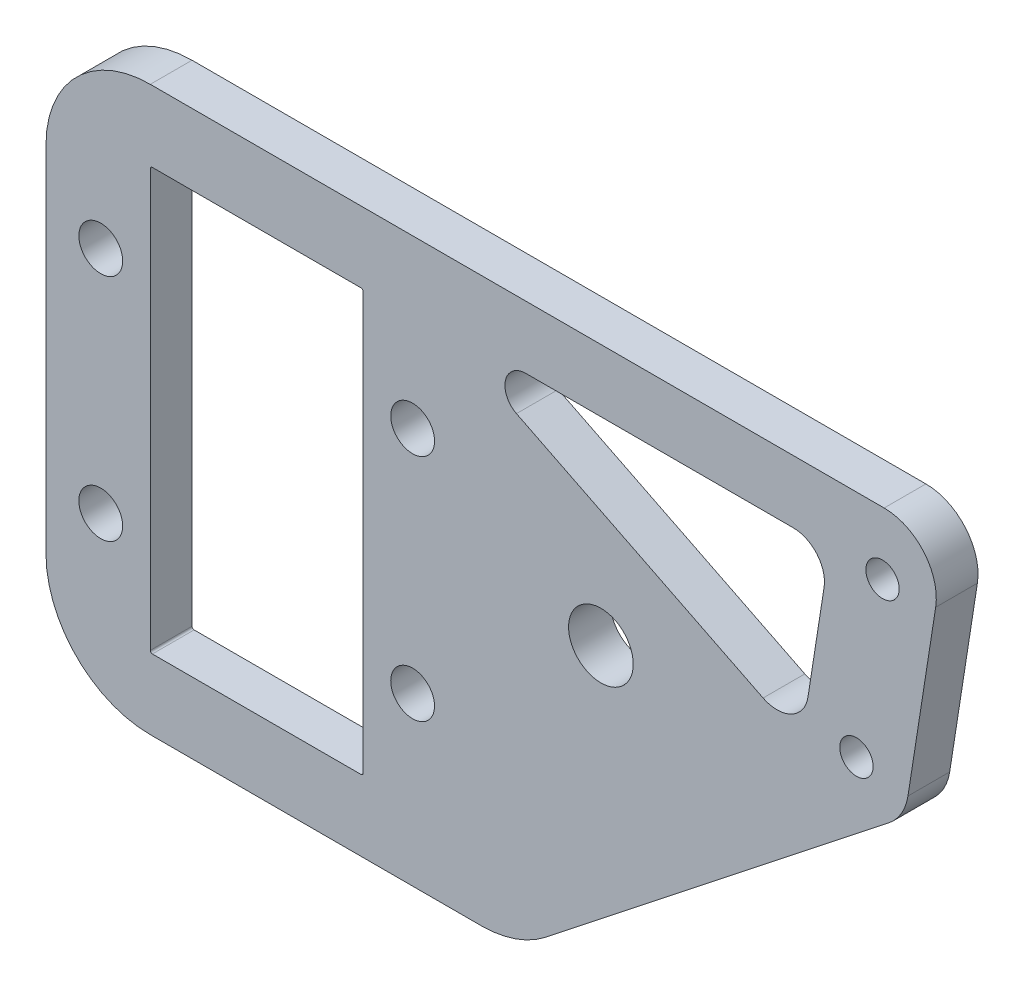
ISO-10303-21;
HEADER;
FILE_DESCRIPTION(('STEP AP214'),'2;1');
FILE_NAME('part.step','',(''),(''),'','','');
FILE_SCHEMA(('AUTOMOTIVE_DESIGN { 1 0 10303 214 1 1 1 1 }'));
ENDSEC;
DATA;
#1=APPLICATION_CONTEXT('core data for automotive mechanical design processes');
#2=APPLICATION_PROTOCOL_DEFINITION('international standard','automotive_design',2000,#1);
#3=PRODUCT_CONTEXT('',#1,'mechanical');
#4=PRODUCT('Part','Part','',(#3));
#5=PRODUCT_RELATED_PRODUCT_CATEGORY('part','',(#4));
#6=PRODUCT_DEFINITION_FORMATION('','',#4);
#7=PRODUCT_DEFINITION_CONTEXT('part definition',#1,'design');
#8=PRODUCT_DEFINITION('design','',#6,#7);
#9=PRODUCT_DEFINITION_SHAPE('','',#8);
#10=(LENGTH_UNIT() NAMED_UNIT(*) SI_UNIT(.MILLI.,.METRE.));
#11=(NAMED_UNIT(*) PLANE_ANGLE_UNIT() SI_UNIT($,.RADIAN.));
#12=(NAMED_UNIT(*) SI_UNIT($,.STERADIAN.) SOLID_ANGLE_UNIT());
#13=UNCERTAINTY_MEASURE_WITH_UNIT(LENGTH_MEASURE(1.E-05),#10,'distance_accuracy_value','');
#14=(GEOMETRIC_REPRESENTATION_CONTEXT(3) GLOBAL_UNCERTAINTY_ASSIGNED_CONTEXT((#13)) GLOBAL_UNIT_ASSIGNED_CONTEXT((#10,
#11,#12)) REPRESENTATION_CONTEXT('',''));
#15=CARTESIAN_POINT('',(0.,0.,0.));
#16=DIRECTION('',(0.,0.,1.));
#17=DIRECTION('',(1.,0.,0.));
#18=AXIS2_PLACEMENT_3D('',#15,#16,#17);
#19=CARTESIAN_POINT('',(-10.2,-17.,4.));
#20=DIRECTION('',(0.,0.,-1.));
#21=DIRECTION('',(-1.,0.,0.));
#22=AXIS2_PLACEMENT_3D('',#19,#20,#21);
#23=PLANE('',#22);
#24=DIRECTION('',(-1.,0.,0.));
#25=VECTOR('',#24,1.);
#26=CARTESIAN_POINT('',(25.7980162916883,21.,4.));
#27=LINE('',#26,#25);
#28=CARTESIAN_POINT('',(51.4341826296492,21.,4.));
#29=VERTEX_POINT('',#28);
#30=CARTESIAN_POINT('',(25.7980162916883,21.,4.));
#31=VERTEX_POINT('',#30);
#32=EDGE_CURVE('E210',#29,#31,#27,.T.);
#33=ORIENTED_EDGE('',*,*,#32,.F.);
#34=CARTESIAN_POINT('',(51.4341826296492,18.,4.));
#35=DIRECTION('',(0.,0.,1.));
#36=DIRECTION('',(1.,0.,0.));
#37=AXIS2_PLACEMENT_3D('',#34,#35,#36);
#38=CIRCLE('',#37,3.);
#39=CARTESIAN_POINT('',(54.3982187309025,17.5368693591792,4.));
#40=VERTEX_POINT('',#39);
#41=EDGE_CURVE('E53',#40,#29,#38,.T.);
#42=ORIENTED_EDGE('',*,*,#41,.F.);
#43=DIRECTION('',(0.15437688027361,0.988012033751101,0.));
#44=VECTOR('',#43,1.);
#45=CARTESIAN_POINT('',(54.3982187309025,17.5368693591792,4.));
#46=LINE('',#45,#44);
#47=CARTESIAN_POINT('',(52.8522329335242,7.64256025595795,4.));
#48=VERTEX_POINT('',#47);
#49=EDGE_CURVE('E225',#48,#40,#46,.T.);
#50=ORIENTED_EDGE('',*,*,#49,.F.);
#51=CARTESIAN_POINT('',(49.8881968322709,8.10569089677878,4.));
#52=DIRECTION('',(0.,0.,1.));
#53=DIRECTION('',(1.,0.,0.));
#54=AXIS2_PLACEMENT_3D('',#51,#52,#53);
#55=CIRCLE('',#54,2.99999999999999);
#56=CARTESIAN_POINT('',(48.5495316817207,5.42092356706426,4.));
#57=VERTEX_POINT('',#56);
#58=EDGE_CURVE('E219',#57,#48,#55,.T.);
#59=ORIENTED_EDGE('',*,*,#58,.F.);
#60=DIRECTION('',(0.894922443238175,-0.44622171685006,0.));
#61=VECTOR('',#60,1.);
#62=CARTESIAN_POINT('',(48.5495316817207,5.42092356706425,4.));
#63=LINE('',#62,#61);
#64=CARTESIAN_POINT('',(24.9055728579882,17.2101551135237,4.));
#65=VERTEX_POINT('',#64);
#66=EDGE_CURVE('E217',#65,#57,#63,.T.);
#67=ORIENTED_EDGE('',*,*,#66,.F.);
#68=CARTESIAN_POINT('',(25.7980162916883,19.,4.));
#69=DIRECTION('',(0.,0.,1.));
#70=DIRECTION('',(-1.,0.,0.));
#71=AXIS2_PLACEMENT_3D('',#68,#69,#70);
#72=CIRCLE('',#71,2.);
#73=EDGE_CURVE('E201',#31,#65,#72,.T.);
#74=ORIENTED_EDGE('',*,*,#73,.F.);
#75=EDGE_LOOP('',(#33,#42,#50,#59,#67,#74));
#76=FACE_BOUND('',#75,.T.);
#77=CARTESIAN_POINT('',(-14.95,11.,4.));
#78=DIRECTION('',(0.,0.,1.));
#79=DIRECTION('',(-1.,0.,0.));
#80=AXIS2_PLACEMENT_3D('',#77,#78,#79);
#81=CIRCLE('',#80,2.1);
#82=CARTESIAN_POINT('',(-17.05,11.,4.));
#83=VERTEX_POINT('',#82);
#84=EDGE_CURVE('E230',#83,#83,#81,.T.);
#85=ORIENTED_EDGE('',*,*,#84,.F.);
#86=EDGE_LOOP('',(#85));
#87=FACE_BOUND('',#86,.T.);
#88=CARTESIAN_POINT('',(-14.95,-11.,4.));
#89=DIRECTION('',(0.,0.,1.));
#90=DIRECTION('',(1.,0.,0.));
#91=AXIS2_PLACEMENT_3D('',#88,#89,#90);
#92=CIRCLE('',#91,2.1);
#93=CARTESIAN_POINT('',(-12.85,-11.,4.));
#94=VERTEX_POINT('',#93);
#95=EDGE_CURVE('E247',#94,#94,#92,.T.);
#96=ORIENTED_EDGE('',*,*,#95,.F.);
#97=EDGE_LOOP('',(#96));
#98=FACE_BOUND('',#97,.T.);
#99=CARTESIAN_POINT('',(14.95,-11.,4.));
#100=DIRECTION('',(0.,0.,1.));
#101=DIRECTION('',(-1.,0.,0.));
#102=AXIS2_PLACEMENT_3D('',#99,#100,#101);
#103=CIRCLE('',#102,2.1);
#104=CARTESIAN_POINT('',(12.85,-11.,4.));
#105=VERTEX_POINT('',#104);
#106=EDGE_CURVE('E241',#105,#105,#103,.T.);
#107=ORIENTED_EDGE('',*,*,#106,.F.);
#108=EDGE_LOOP('',(#107));
#109=FACE_BOUND('',#108,.T.);
#110=CARTESIAN_POINT('',(14.95,11.,4.));
#111=DIRECTION('',(0.,0.,1.));
#112=DIRECTION('',(1.,0.,0.));
#113=AXIS2_PLACEMENT_3D('',#110,#111,#112);
#114=CIRCLE('',#113,2.1);
#115=CARTESIAN_POINT('',(17.05,11.,4.));
#116=VERTEX_POINT('',#115);
#117=EDGE_CURVE('E240',#116,#116,#114,.T.);
#118=ORIENTED_EDGE('',*,*,#117,.F.);
#119=EDGE_LOOP('',(#118));
#120=FACE_BOUND('',#119,.T.);
#121=CARTESIAN_POINT('',(-10.2,-17.,4.));
#122=DIRECTION('',(0.,0.,1.));
#123=DIRECTION('',(-1.,0.,0.));
#124=AXIS2_PLACEMENT_3D('',#121,#122,#123);
#125=CIRCLE('',#124,10.);
#126=CARTESIAN_POINT('',(-20.2,-17.,4.));
#127=VERTEX_POINT('',#126);
#128=CARTESIAN_POINT('',(-10.2,-27.,4.));
#129=VERTEX_POINT('',#128);
#130=EDGE_CURVE('E303',#127,#129,#125,.T.);
#131=ORIENTED_EDGE('',*,*,#130,.T.);
#132=DIRECTION('',(1.,0.,0.));
#133=VECTOR('',#132,1.);
#134=CARTESIAN_POINT('',(21.5311175215682,-27.,4.));
#135=LINE('',#134,#133);
#136=CARTESIAN_POINT('',(21.5311175215682,-27.,4.));
#137=VERTEX_POINT('',#136);
#138=EDGE_CURVE('E306',#129,#137,#135,.T.);
#139=ORIENTED_EDGE('',*,*,#138,.T.);
#140=CARTESIAN_POINT('',(21.5311175215682,-17.,4.));
#141=DIRECTION('',(0.,0.,1.));
#142=DIRECTION('',(1.,0.,0.));
#143=AXIS2_PLACEMENT_3D('',#140,#141,#142);
#144=CIRCLE('',#143,10.);
#145=CARTESIAN_POINT('',(27.7237178602118,-24.8518597189349,4.));
#146=VERTEX_POINT('',#145);
#147=EDGE_CURVE('E309',#137,#146,#144,.T.);
#148=ORIENTED_EDGE('',*,*,#147,.T.);
#149=DIRECTION('',(0.785185971893485,0.619260033864355,0.));
#150=VECTOR('',#149,1.);
#151=CARTESIAN_POINT('',(27.7237178602118,-24.8518597189349,4.));
#152=LINE('',#151,#150);
#153=CARTESIAN_POINT('',(60.5963001693218,1.07407014053258,4.));
#154=VERTEX_POINT('',#153);
#155=EDGE_CURVE('E311',#146,#154,#152,.T.);
#156=ORIENTED_EDGE('',*,*,#155,.T.);
#157=CARTESIAN_POINT('',(57.5,5.,4.));
#158=DIRECTION('',(0.,0.,1.));
#159=DIRECTION('',(1.,0.,0.));
#160=AXIS2_PLACEMENT_3D('',#157,#158,#159);
#161=CIRCLE('',#160,4.99999999999999);
#162=CARTESIAN_POINT('',(62.4400601687555,4.22811559863195,4.));
#163=VERTEX_POINT('',#162);
#164=EDGE_CURVE('E313',#154,#163,#161,.T.);
#165=ORIENTED_EDGE('',*,*,#164,.T.);
#166=DIRECTION('',(0.15437688027361,0.988012033751101,0.));
#167=VECTOR('',#166,1.);
#168=CARTESIAN_POINT('',(62.4400601687555,4.22811559863195,4.));
#169=LINE('',#168,#167);
#170=CARTESIAN_POINT('',(65.0963101687555,21.228115598632,4.));
#171=VERTEX_POINT('',#170);
#172=EDGE_CURVE('E315',#163,#171,#169,.T.);
#173=ORIENTED_EDGE('',*,*,#172,.T.);
#174=CARTESIAN_POINT('',(60.15625,22.,4.));
#175=DIRECTION('',(0.,0.,1.));
#176=DIRECTION('',(1.,0.,0.));
#177=AXIS2_PLACEMENT_3D('',#174,#175,#176);
#178=CIRCLE('',#177,5.);
#179=CARTESIAN_POINT('',(60.15625,27.,4.));
#180=VERTEX_POINT('',#179);
#181=EDGE_CURVE('E317',#171,#180,#178,.T.);
#182=ORIENTED_EDGE('',*,*,#181,.T.);
#183=DIRECTION('',(-1.,0.,0.));
#184=VECTOR('',#183,1.);
#185=CARTESIAN_POINT('',(-10.2,27.,4.));
#186=LINE('',#185,#184);
#187=CARTESIAN_POINT('',(-10.2,27.,4.));
#188=VERTEX_POINT('',#187);
#189=EDGE_CURVE('E319',#180,#188,#186,.T.);
#190=ORIENTED_EDGE('',*,*,#189,.T.);
#191=CARTESIAN_POINT('',(-10.2,17.,4.));
#192=DIRECTION('',(0.,0.,1.));
#193=DIRECTION('',(1.,0.,0.));
#194=AXIS2_PLACEMENT_3D('',#191,#192,#193);
#195=CIRCLE('',#194,10.);
#196=CARTESIAN_POINT('',(-20.2,17.,4.));
#197=VERTEX_POINT('',#196);
#198=EDGE_CURVE('E321',#188,#197,#195,.T.);
#199=ORIENTED_EDGE('',*,*,#198,.T.);
#200=DIRECTION('',(0.,-1.,0.));
#201=VECTOR('',#200,1.);
#202=CARTESIAN_POINT('',(-20.2,-17.,4.));
#203=LINE('',#202,#201);
#204=EDGE_CURVE('E323',#197,#127,#203,.T.);
#205=ORIENTED_EDGE('',*,*,#204,.T.);
#206=EDGE_LOOP('',(#131,#139,#148,#156,#165,#173,#182,#190,#199,#205));
#207=FACE_BOUND('',#206,.T.);
#208=DIRECTION('',(0.,-1.,0.));
#209=VECTOR('',#208,1.);
#210=CARTESIAN_POINT('',(-10.2,-20.2,4.));
#211=LINE('',#210,#209);
#212=CARTESIAN_POINT('',(-10.2,20.,4.));
#213=VERTEX_POINT('',#212);
#214=CARTESIAN_POINT('',(-10.2,-20.,4.));
#215=VERTEX_POINT('',#214);
#216=EDGE_CURVE('E279',#213,#215,#211,.T.);
#217=ORIENTED_EDGE('',*,*,#216,.F.);
#218=CARTESIAN_POINT('',(-9.99999999999999,20.,4.));
#219=DIRECTION('',(0.,0.,-1.));
#220=DIRECTION('',(-1.,0.,0.));
#221=AXIS2_PLACEMENT_3D('',#218,#219,#220);
#222=CIRCLE('',#221,0.2);
#223=CARTESIAN_POINT('',(-9.99999999999999,20.2,4.));
#224=VERTEX_POINT('',#223);
#225=EDGE_CURVE('E404',#213,#224,#222,.T.);
#226=ORIENTED_EDGE('',*,*,#225,.T.);
#227=DIRECTION('',(-1.,0.,0.));
#228=VECTOR('',#227,1.);
#229=CARTESIAN_POINT('',(-10.2,20.2,4.));
#230=LINE('',#229,#228);
#231=CARTESIAN_POINT('',(10.,20.2,4.));
#232=VERTEX_POINT('',#231);
#233=EDGE_CURVE('E289',#232,#224,#230,.T.);
#234=ORIENTED_EDGE('',*,*,#233,.F.);
#235=CARTESIAN_POINT('',(10.,20.,4.));
#236=DIRECTION('',(0.,0.,-1.));
#237=DIRECTION('',(-1.,0.,0.));
#238=AXIS2_PLACEMENT_3D('',#235,#236,#237);
#239=CIRCLE('',#238,0.2);
#240=CARTESIAN_POINT('',(10.2,20.,4.));
#241=VERTEX_POINT('',#240);
#242=EDGE_CURVE('E408',#232,#241,#239,.T.);
#243=ORIENTED_EDGE('',*,*,#242,.T.);
#244=DIRECTION('',(0.,1.,0.));
#245=VECTOR('',#244,1.);
#246=CARTESIAN_POINT('',(10.2,-20.2,4.));
#247=LINE('',#246,#245);
#248=CARTESIAN_POINT('',(10.2,-20.,4.));
#249=VERTEX_POINT('',#248);
#250=EDGE_CURVE('E286',#249,#241,#247,.T.);
#251=ORIENTED_EDGE('',*,*,#250,.F.);
#252=CARTESIAN_POINT('',(10.,-20.,4.));
#253=DIRECTION('',(0.,0.,-1.));
#254=DIRECTION('',(-1.,0.,0.));
#255=AXIS2_PLACEMENT_3D('',#252,#253,#254);
#256=CIRCLE('',#255,0.2);
#257=CARTESIAN_POINT('',(10.,-20.2,4.));
#258=VERTEX_POINT('',#257);
#259=EDGE_CURVE('E396',#249,#258,#256,.T.);
#260=ORIENTED_EDGE('',*,*,#259,.T.);
#261=DIRECTION('',(1.,0.,0.));
#262=VECTOR('',#261,1.);
#263=CARTESIAN_POINT('',(-10.2,-20.2,4.));
#264=LINE('',#263,#262);
#265=CARTESIAN_POINT('',(-9.99999999999999,-20.2,4.));
#266=VERTEX_POINT('',#265);
#267=EDGE_CURVE('E282',#266,#258,#264,.T.);
#268=ORIENTED_EDGE('',*,*,#267,.F.);
#269=CARTESIAN_POINT('',(-9.99999999999999,-20.,4.));
#270=DIRECTION('',(0.,0.,-1.));
#271=DIRECTION('',(-1.,0.,0.));
#272=AXIS2_PLACEMENT_3D('',#269,#270,#271);
#273=CIRCLE('',#272,0.2);
#274=EDGE_CURVE('E400',#266,#215,#273,.T.);
#275=ORIENTED_EDGE('',*,*,#274,.T.);
#276=EDGE_LOOP('',(#217,#226,#234,#243,#251,#260,#268,#275));
#277=FACE_BOUND('',#276,.T.);
#278=CARTESIAN_POINT('',(33.,2.,4.));
#279=DIRECTION('',(0.,0.,1.));
#280=DIRECTION('',(1.,0.,0.));
#281=AXIS2_PLACEMENT_3D('',#278,#279,#280);
#282=CIRCLE('',#281,3.1);
#283=CARTESIAN_POINT('',(36.1,2.,4.));
#284=VERTEX_POINT('',#283);
#285=EDGE_CURVE('E273',#284,#284,#282,.T.);
#286=ORIENTED_EDGE('',*,*,#285,.F.);
#287=EDGE_LOOP('',(#286));
#288=FACE_BOUND('',#287,.T.);
#289=CARTESIAN_POINT('',(60.,21.,4.));
#290=DIRECTION('',(0.,0.,1.));
#291=DIRECTION('',(1.,0.,0.));
#292=AXIS2_PLACEMENT_3D('',#289,#290,#291);
#293=CIRCLE('',#292,1.6);
#294=CARTESIAN_POINT('',(61.6,21.,4.));
#295=VERTEX_POINT('',#294);
#296=EDGE_CURVE('E267',#295,#295,#293,.T.);
#297=ORIENTED_EDGE('',*,*,#296,.F.);
#298=EDGE_LOOP('',(#297));
#299=FACE_BOUND('',#298,.T.);
#300=CARTESIAN_POINT('',(57.5,5.,4.));
#301=DIRECTION('',(0.,0.,1.));
#302=DIRECTION('',(1.,0.,0.));
#303=AXIS2_PLACEMENT_3D('',#300,#301,#302);
#304=CIRCLE('',#303,1.59999999999982);
#305=CARTESIAN_POINT('',(59.0999999999998,5.,4.));
#306=VERTEX_POINT('',#305);
#307=EDGE_CURVE('E261',#306,#306,#304,.T.);
#308=ORIENTED_EDGE('',*,*,#307,.F.);
#309=EDGE_LOOP('',(#308));
#310=FACE_BOUND('',#309,.T.);
#311=ADVANCED_FACE('F38',(#76,#87,#98,#109,#120,#207,#277,#288,#299,#310),#23,.F.);
#312=CARTESIAN_POINT('',(-10.2,-17.,0.));
#313=DIRECTION('',(0.,0.,-1.));
#314=DIRECTION('',(-1.,0.,0.));
#315=AXIS2_PLACEMENT_3D('',#312,#313,#314);
#316=PLANE('',#315);
#317=CARTESIAN_POINT('',(51.4341826296492,18.,0.));
#318=DIRECTION('',(0.,0.,-1.));
#319=DIRECTION('',(-1.,0.,0.));
#320=AXIS2_PLACEMENT_3D('',#317,#318,#319);
#321=CIRCLE('',#320,3.);
#322=CARTESIAN_POINT('',(51.4341826296492,21.,0.));
#323=VERTEX_POINT('',#322);
#324=CARTESIAN_POINT('',(54.3982187309025,17.5368693591792,0.));
#325=VERTEX_POINT('',#324);
#326=EDGE_CURVE('E11',#323,#325,#321,.T.);
#327=ORIENTED_EDGE('',*,*,#326,.F.);
#328=DIRECTION('',(1.,0.,0.));
#329=VECTOR('',#328,1.);
#330=CARTESIAN_POINT('',(-10.2,21.,0.));
#331=LINE('',#330,#329);
#332=CARTESIAN_POINT('',(25.7980162916883,21.,0.));
#333=VERTEX_POINT('',#332);
#334=EDGE_CURVE('E410',#333,#323,#331,.T.);
#335=ORIENTED_EDGE('',*,*,#334,.F.);
#336=CARTESIAN_POINT('',(25.7980162916883,19.,0.));
#337=DIRECTION('',(0.,0.,-1.));
#338=DIRECTION('',(-1.,0.,0.));
#339=AXIS2_PLACEMENT_3D('',#336,#337,#338);
#340=CIRCLE('',#339,2.);
#341=CARTESIAN_POINT('',(24.9055728579882,17.2101551135237,0.));
#342=VERTEX_POINT('',#341);
#343=EDGE_CURVE('E204',#342,#333,#340,.T.);
#344=ORIENTED_EDGE('',*,*,#343,.F.);
#345=DIRECTION('',(-0.894922443238175,0.44622171685006,0.));
#346=VECTOR('',#345,1.);
#347=CARTESIAN_POINT('',(10.4512769702472,24.4172832569957,0.));
#348=LINE('',#347,#346);
#349=CARTESIAN_POINT('',(48.5495316817207,5.42092356706426,0.));
#350=VERTEX_POINT('',#349);
#351=EDGE_CURVE('E413',#350,#342,#348,.T.);
#352=ORIENTED_EDGE('',*,*,#351,.F.);
#353=CARTESIAN_POINT('',(49.8881968322709,8.10569089677878,0.));
#354=DIRECTION('',(0.,0.,-1.));
#355=DIRECTION('',(-1.,0.,0.));
#356=AXIS2_PLACEMENT_3D('',#353,#354,#355);
#357=CIRCLE('',#356,2.99999999999999);
#358=CARTESIAN_POINT('',(52.8522329335242,7.64256025595795,0.));
#359=VERTEX_POINT('',#358);
#360=EDGE_CURVE('E415',#359,#350,#357,.T.);
#361=ORIENTED_EDGE('',*,*,#360,.F.);
#362=DIRECTION('',(-0.15437688027361,-0.988012033751101,0.));
#363=VECTOR('',#362,1.);
#364=CARTESIAN_POINT('',(47.5909217187564,-26.0298315185557,0.));
#365=LINE('',#364,#363);
#366=EDGE_CURVE('E46',#325,#359,#365,.T.);
#367=ORIENTED_EDGE('',*,*,#366,.F.);
#368=EDGE_LOOP('',(#327,#335,#344,#352,#361,#367));
#369=FACE_BOUND('',#368,.T.);
#370=CARTESIAN_POINT('',(-14.95,11.,0.));
#371=DIRECTION('',(0.,0.,1.));
#372=DIRECTION('',(-1.,0.,0.));
#373=AXIS2_PLACEMENT_3D('',#370,#371,#372);
#374=CIRCLE('',#373,2.1);
#375=CARTESIAN_POINT('',(-17.05,11.,0.));
#376=VERTEX_POINT('',#375);
#377=EDGE_CURVE('E250',#376,#376,#374,.T.);
#378=ORIENTED_EDGE('',*,*,#377,.T.);
#379=EDGE_LOOP('',(#378));
#380=FACE_BOUND('',#379,.T.);
#381=CARTESIAN_POINT('',(-14.95,-11.,0.));
#382=DIRECTION('',(0.,0.,1.));
#383=DIRECTION('',(1.,0.,0.));
#384=AXIS2_PLACEMENT_3D('',#381,#382,#383);
#385=CIRCLE('',#384,2.1);
#386=CARTESIAN_POINT('',(-12.85,-11.,0.));
#387=VERTEX_POINT('',#386);
#388=EDGE_CURVE('E244',#387,#387,#385,.T.);
#389=ORIENTED_EDGE('',*,*,#388,.T.);
#390=EDGE_LOOP('',(#389));
#391=FACE_BOUND('',#390,.T.);
#392=CARTESIAN_POINT('',(14.95,-11.,0.));
#393=DIRECTION('',(0.,0.,1.));
#394=DIRECTION('',(-1.,0.,0.));
#395=AXIS2_PLACEMENT_3D('',#392,#393,#394);
#396=CIRCLE('',#395,2.1);
#397=CARTESIAN_POINT('',(12.85,-11.,0.));
#398=VERTEX_POINT('',#397);
#399=EDGE_CURVE('E237',#398,#398,#396,.T.);
#400=ORIENTED_EDGE('',*,*,#399,.T.);
#401=EDGE_LOOP('',(#400));
#402=FACE_BOUND('',#401,.T.);
#403=CARTESIAN_POINT('',(14.95,11.,0.));
#404=DIRECTION('',(0.,0.,1.));
#405=DIRECTION('',(1.,0.,0.));
#406=AXIS2_PLACEMENT_3D('',#403,#404,#405);
#407=CIRCLE('',#406,2.1);
#408=CARTESIAN_POINT('',(17.05,11.,0.));
#409=VERTEX_POINT('',#408);
#410=EDGE_CURVE('E255',#409,#409,#407,.T.);
#411=ORIENTED_EDGE('',*,*,#410,.T.);
#412=EDGE_LOOP('',(#411));
#413=FACE_BOUND('',#412,.T.);
#414=CARTESIAN_POINT('',(60.,21.,0.));
#415=DIRECTION('',(0.,0.,1.));
#416=DIRECTION('',(1.,0.,0.));
#417=AXIS2_PLACEMENT_3D('',#414,#415,#416);
#418=CIRCLE('',#417,1.6);
#419=CARTESIAN_POINT('',(61.6,21.,0.));
#420=VERTEX_POINT('',#419);
#421=EDGE_CURVE('E264',#420,#420,#418,.T.);
#422=ORIENTED_EDGE('',*,*,#421,.T.);
#423=EDGE_LOOP('',(#422));
#424=FACE_BOUND('',#423,.T.);
#425=DIRECTION('',(0.,1.,0.));
#426=VECTOR('',#425,1.);
#427=CARTESIAN_POINT('',(10.2,-20.2,0.));
#428=LINE('',#427,#426);
#429=CARTESIAN_POINT('',(10.2,-20.,0.));
#430=VERTEX_POINT('',#429);
#431=CARTESIAN_POINT('',(10.2,20.,0.));
#432=VERTEX_POINT('',#431);
#433=EDGE_CURVE('E298',#430,#432,#428,.T.);
#434=ORIENTED_EDGE('',*,*,#433,.T.);
#435=CARTESIAN_POINT('',(10.,20.,0.));
#436=DIRECTION('',(0.,0.,-1.));
#437=DIRECTION('',(-1.,0.,0.));
#438=AXIS2_PLACEMENT_3D('',#435,#436,#437);
#439=CIRCLE('',#438,0.2);
#440=CARTESIAN_POINT('',(10.,20.2,0.));
#441=VERTEX_POINT('',#440);
#442=EDGE_CURVE('E406',#432,#441,#439,.F.);
#443=ORIENTED_EDGE('',*,*,#442,.T.);
#444=DIRECTION('',(-1.,0.,0.));
#445=VECTOR('',#444,1.);
#446=CARTESIAN_POINT('',(-10.2,20.2,0.));
#447=LINE('',#446,#445);
#448=CARTESIAN_POINT('',(-9.99999999999999,20.2,0.));
#449=VERTEX_POINT('',#448);
#450=EDGE_CURVE('E283',#441,#449,#447,.T.);
#451=ORIENTED_EDGE('',*,*,#450,.T.);
#452=CARTESIAN_POINT('',(-9.99999999999999,20.,0.));
#453=DIRECTION('',(0.,0.,-1.));
#454=DIRECTION('',(-1.,0.,0.));
#455=AXIS2_PLACEMENT_3D('',#452,#453,#454);
#456=CIRCLE('',#455,0.2);
#457=CARTESIAN_POINT('',(-10.2,20.,0.));
#458=VERTEX_POINT('',#457);
#459=EDGE_CURVE('E402',#449,#458,#456,.F.);
#460=ORIENTED_EDGE('',*,*,#459,.T.);
#461=DIRECTION('',(0.,-1.,0.));
#462=VECTOR('',#461,1.);
#463=CARTESIAN_POINT('',(-10.2,-20.2,0.));
#464=LINE('',#463,#462);
#465=CARTESIAN_POINT('',(-10.2,-20.,0.));
#466=VERTEX_POINT('',#465);
#467=EDGE_CURVE('E276',#458,#466,#464,.T.);
#468=ORIENTED_EDGE('',*,*,#467,.T.);
#469=CARTESIAN_POINT('',(-9.99999999999999,-20.,0.));
#470=DIRECTION('',(0.,0.,-1.));
#471=DIRECTION('',(-1.,0.,0.));
#472=AXIS2_PLACEMENT_3D('',#469,#470,#471);
#473=CIRCLE('',#472,0.2);
#474=CARTESIAN_POINT('',(-9.99999999999999,-20.2,0.));
#475=VERTEX_POINT('',#474);
#476=EDGE_CURVE('E398',#466,#475,#473,.F.);
#477=ORIENTED_EDGE('',*,*,#476,.T.);
#478=DIRECTION('',(1.,0.,0.));
#479=VECTOR('',#478,1.);
#480=CARTESIAN_POINT('',(-10.2,-20.2,0.));
#481=LINE('',#480,#479);
#482=CARTESIAN_POINT('',(10.,-20.2,0.));
#483=VERTEX_POINT('',#482);
#484=EDGE_CURVE('E295',#475,#483,#481,.T.);
#485=ORIENTED_EDGE('',*,*,#484,.T.);
#486=CARTESIAN_POINT('',(10.,-20.,0.));
#487=DIRECTION('',(0.,0.,-1.));
#488=DIRECTION('',(-1.,0.,0.));
#489=AXIS2_PLACEMENT_3D('',#486,#487,#488);
#490=CIRCLE('',#489,0.2);
#491=EDGE_CURVE('E394',#483,#430,#490,.F.);
#492=ORIENTED_EDGE('',*,*,#491,.T.);
#493=EDGE_LOOP('',(#434,#443,#451,#460,#468,#477,#485,#492));
#494=FACE_BOUND('',#493,.T.);
#495=CARTESIAN_POINT('',(-10.2,-17.,0.));
#496=DIRECTION('',(0.,0.,1.));
#497=DIRECTION('',(-1.,0.,0.));
#498=AXIS2_PLACEMENT_3D('',#495,#496,#497);
#499=CIRCLE('',#498,10.);
#500=CARTESIAN_POINT('',(-20.2,-17.,0.));
#501=VERTEX_POINT('',#500);
#502=CARTESIAN_POINT('',(-10.2,-27.,0.));
#503=VERTEX_POINT('',#502);
#504=EDGE_CURVE('E292',#501,#503,#499,.T.);
#505=ORIENTED_EDGE('',*,*,#504,.F.);
#506=DIRECTION('',(0.,-1.,0.));
#507=VECTOR('',#506,1.);
#508=CARTESIAN_POINT('',(-20.2,-17.,0.));
#509=LINE('',#508,#507);
#510=CARTESIAN_POINT('',(-20.2,17.,0.));
#511=VERTEX_POINT('',#510);
#512=EDGE_CURVE('E307',#511,#501,#509,.T.);
#513=ORIENTED_EDGE('',*,*,#512,.F.);
#514=CARTESIAN_POINT('',(-10.2,17.,0.));
#515=DIRECTION('',(0.,0.,1.));
#516=DIRECTION('',(1.,0.,0.));
#517=AXIS2_PLACEMENT_3D('',#514,#515,#516);
#518=CIRCLE('',#517,10.);
#519=CARTESIAN_POINT('',(-10.2,27.,0.));
#520=VERTEX_POINT('',#519);
#521=EDGE_CURVE('E342',#520,#511,#518,.T.);
#522=ORIENTED_EDGE('',*,*,#521,.F.);
#523=DIRECTION('',(-1.,0.,0.));
#524=VECTOR('',#523,1.);
#525=CARTESIAN_POINT('',(-10.2,27.,0.));
#526=LINE('',#525,#524);
#527=CARTESIAN_POINT('',(60.15625,27.,0.));
#528=VERTEX_POINT('',#527);
#529=EDGE_CURVE('E340',#528,#520,#526,.T.);
#530=ORIENTED_EDGE('',*,*,#529,.F.);
#531=CARTESIAN_POINT('',(60.15625,22.,0.));
#532=DIRECTION('',(0.,0.,1.));
#533=DIRECTION('',(1.,0.,0.));
#534=AXIS2_PLACEMENT_3D('',#531,#532,#533);
#535=CIRCLE('',#534,5.);
#536=CARTESIAN_POINT('',(65.0963101687555,21.228115598632,0.));
#537=VERTEX_POINT('',#536);
#538=EDGE_CURVE('E338',#537,#528,#535,.T.);
#539=ORIENTED_EDGE('',*,*,#538,.F.);
#540=DIRECTION('',(0.15437688027361,0.988012033751101,0.));
#541=VECTOR('',#540,1.);
#542=CARTESIAN_POINT('',(62.4400601687555,4.22811559863195,0.));
#543=LINE('',#542,#541);
#544=CARTESIAN_POINT('',(62.4400601687555,4.22811559863195,0.));
#545=VERTEX_POINT('',#544);
#546=EDGE_CURVE('E336',#545,#537,#543,.T.);
#547=ORIENTED_EDGE('',*,*,#546,.F.);
#548=CARTESIAN_POINT('',(57.5,5.,0.));
#549=DIRECTION('',(0.,0.,1.));
#550=DIRECTION('',(1.,0.,0.));
#551=AXIS2_PLACEMENT_3D('',#548,#549,#550);
#552=CIRCLE('',#551,4.99999999999999);
#553=CARTESIAN_POINT('',(60.5963001693218,1.07407014053258,0.));
#554=VERTEX_POINT('',#553);
#555=EDGE_CURVE('E334',#554,#545,#552,.T.);
#556=ORIENTED_EDGE('',*,*,#555,.F.);
#557=DIRECTION('',(0.785185971893485,0.619260033864355,0.));
#558=VECTOR('',#557,1.);
#559=CARTESIAN_POINT('',(27.7237178602118,-24.8518597189349,0.));
#560=LINE('',#559,#558);
#561=CARTESIAN_POINT('',(27.7237178602118,-24.8518597189349,0.));
#562=VERTEX_POINT('',#561);
#563=EDGE_CURVE('E332',#562,#554,#560,.T.);
#564=ORIENTED_EDGE('',*,*,#563,.F.);
#565=CARTESIAN_POINT('',(21.5311175215682,-17.,0.));
#566=DIRECTION('',(0.,0.,1.));
#567=DIRECTION('',(1.,0.,0.));
#568=AXIS2_PLACEMENT_3D('',#565,#566,#567);
#569=CIRCLE('',#568,10.);
#570=CARTESIAN_POINT('',(21.5311175215682,-27.,0.));
#571=VERTEX_POINT('',#570);
#572=EDGE_CURVE('E330',#571,#562,#569,.T.);
#573=ORIENTED_EDGE('',*,*,#572,.F.);
#574=DIRECTION('',(1.,0.,0.));
#575=VECTOR('',#574,1.);
#576=CARTESIAN_POINT('',(21.5311175215682,-27.,0.));
#577=LINE('',#576,#575);
#578=EDGE_CURVE('E328',#503,#571,#577,.T.);
#579=ORIENTED_EDGE('',*,*,#578,.F.);
#580=EDGE_LOOP('',(#505,#513,#522,#530,#539,#547,#556,#564,#573,#579));
#581=FACE_BOUND('',#580,.T.);
#582=CARTESIAN_POINT('',(33.,2.,0.));
#583=DIRECTION('',(0.,0.,1.));
#584=DIRECTION('',(1.,0.,0.));
#585=AXIS2_PLACEMENT_3D('',#582,#583,#584);
#586=CIRCLE('',#585,3.1);
#587=CARTESIAN_POINT('',(36.1,2.,0.));
#588=VERTEX_POINT('',#587);
#589=EDGE_CURVE('E270',#588,#588,#586,.T.);
#590=ORIENTED_EDGE('',*,*,#589,.T.);
#591=EDGE_LOOP('',(#590));
#592=FACE_BOUND('',#591,.T.);
#593=CARTESIAN_POINT('',(57.5,5.,0.));
#594=DIRECTION('',(0.,0.,1.));
#595=DIRECTION('',(1.,0.,0.));
#596=AXIS2_PLACEMENT_3D('',#593,#594,#595);
#597=CIRCLE('',#596,1.59999999999982);
#598=CARTESIAN_POINT('',(59.0999999999998,5.,0.));
#599=VERTEX_POINT('',#598);
#600=EDGE_CURVE('E258',#599,#599,#597,.T.);
#601=ORIENTED_EDGE('',*,*,#600,.T.);
#602=EDGE_LOOP('',(#601));
#603=FACE_BOUND('',#602,.T.);
#604=ADVANCED_FACE('F429',(#369,#380,#391,#402,#413,#424,#494,#581,#592,#603),#316,.T.);
#605=CARTESIAN_POINT('',(-10.2,-17.,4.));
#606=DIRECTION('',(0.,0.,-1.));
#607=DIRECTION('',(-1.,0.,0.));
#608=AXIS2_PLACEMENT_3D('',#605,#606,#607);
#609=CYLINDRICAL_SURFACE('',#608,10.);
#610=ORIENTED_EDGE('',*,*,#504,.T.);
#611=DIRECTION('',(0.,0.,-1.));
#612=VECTOR('',#611,1.);
#613=CARTESIAN_POINT('',(-10.2,-27.,4.));
#614=LINE('',#613,#612);
#615=EDGE_CURVE('E371',#129,#503,#614,.T.);
#616=ORIENTED_EDGE('',*,*,#615,.F.);
#617=ORIENTED_EDGE('',*,*,#130,.F.);
#618=DIRECTION('',(0.,0.,-1.));
#619=VECTOR('',#618,1.);
#620=CARTESIAN_POINT('',(-20.2,-17.,4.));
#621=LINE('',#620,#619);
#622=EDGE_CURVE('E325',#127,#501,#621,.T.);
#623=ORIENTED_EDGE('',*,*,#622,.T.);
#624=EDGE_LOOP('',(#610,#616,#617,#623));
#625=FACE_BOUND('',#624,.T.);
#626=ADVANCED_FACE('F446',(#625),#609,.T.);
#627=CARTESIAN_POINT('',(21.5311175215682,-27.,4.));
#628=DIRECTION('',(0.,1.,0.));
#629=DIRECTION('',(-1.,0.,0.));
#630=AXIS2_PLACEMENT_3D('',#627,#628,#629);
#631=PLANE('',#630);
#632=ORIENTED_EDGE('',*,*,#578,.T.);
#633=DIRECTION('',(0.,0.,-1.));
#634=VECTOR('',#633,1.);
#635=CARTESIAN_POINT('',(21.5311175215682,-27.,4.));
#636=LINE('',#635,#634);
#637=EDGE_CURVE('E368',#137,#571,#636,.T.);
#638=ORIENTED_EDGE('',*,*,#637,.F.);
#639=ORIENTED_EDGE('',*,*,#138,.F.);
#640=ORIENTED_EDGE('',*,*,#615,.T.);
#641=EDGE_LOOP('',(#632,#638,#639,#640));
#642=FACE_BOUND('',#641,.T.);
#643=ADVANCED_FACE('F483',(#642),#631,.F.);
#644=CARTESIAN_POINT('',(21.5311175215682,-17.,4.));
#645=DIRECTION('',(0.,0.,-1.));
#646=DIRECTION('',(-1.,0.,0.));
#647=AXIS2_PLACEMENT_3D('',#644,#645,#646);
#648=CYLINDRICAL_SURFACE('',#647,10.);
#649=ORIENTED_EDGE('',*,*,#572,.T.);
#650=DIRECTION('',(0.,0.,-1.));
#651=VECTOR('',#650,1.);
#652=CARTESIAN_POINT('',(27.7237178602118,-24.8518597189349,4.));
#653=LINE('',#652,#651);
#654=EDGE_CURVE('E365',#146,#562,#653,.T.);
#655=ORIENTED_EDGE('',*,*,#654,.F.);
#656=ORIENTED_EDGE('',*,*,#147,.F.);
#657=ORIENTED_EDGE('',*,*,#637,.T.);
#658=EDGE_LOOP('',(#649,#655,#656,#657));
#659=FACE_BOUND('',#658,.T.);
#660=ADVANCED_FACE('F479',(#659),#648,.T.);
#661=CARTESIAN_POINT('',(27.7237178602118,-24.8518597189349,4.));
#662=DIRECTION('',(-0.619260033864355,0.785185971893485,0.));
#663=DIRECTION('',(-0.785185971893486,-0.619260033864356,0.));
#664=AXIS2_PLACEMENT_3D('',#661,#662,#663);
#665=PLANE('',#664);
#666=ORIENTED_EDGE('',*,*,#563,.T.);
#667=DIRECTION('',(0.,0.,-1.));
#668=VECTOR('',#667,1.);
#669=CARTESIAN_POINT('',(60.5963001693218,1.07407014053258,4.));
#670=LINE('',#669,#668);
#671=EDGE_CURVE('E362',#154,#554,#670,.T.);
#672=ORIENTED_EDGE('',*,*,#671,.F.);
#673=ORIENTED_EDGE('',*,*,#155,.F.);
#674=ORIENTED_EDGE('',*,*,#654,.T.);
#675=EDGE_LOOP('',(#666,#672,#673,#674));
#676=FACE_BOUND('',#675,.T.);
#677=ADVANCED_FACE('F475',(#676),#665,.F.);
#678=CARTESIAN_POINT('',(57.5,5.,4.));
#679=DIRECTION('',(0.,0.,-1.));
#680=DIRECTION('',(-1.,0.,0.));
#681=AXIS2_PLACEMENT_3D('',#678,#679,#680);
#682=CYLINDRICAL_SURFACE('',#681,4.99999999999999);
#683=ORIENTED_EDGE('',*,*,#555,.T.);
#684=DIRECTION('',(0.,0.,-1.));
#685=VECTOR('',#684,1.);
#686=CARTESIAN_POINT('',(62.4400601687555,4.22811559863195,4.));
#687=LINE('',#686,#685);
#688=EDGE_CURVE('E359',#163,#545,#687,.T.);
#689=ORIENTED_EDGE('',*,*,#688,.F.);
#690=ORIENTED_EDGE('',*,*,#164,.F.);
#691=ORIENTED_EDGE('',*,*,#671,.T.);
#692=EDGE_LOOP('',(#683,#689,#690,#691));
#693=FACE_BOUND('',#692,.T.);
#694=ADVANCED_FACE('F471',(#693),#682,.T.);
#695=CARTESIAN_POINT('',(62.4400601687555,4.22811559863195,4.));
#696=DIRECTION('',(-0.988012033751101,0.15437688027361,0.));
#697=DIRECTION('',(-0.15437688027361,-0.988012033751101,0.));
#698=AXIS2_PLACEMENT_3D('',#695,#696,#697);
#699=PLANE('',#698);
#700=ORIENTED_EDGE('',*,*,#546,.T.);
#701=DIRECTION('',(0.,0.,-1.));
#702=VECTOR('',#701,1.);
#703=CARTESIAN_POINT('',(65.0963101687555,21.228115598632,4.));
#704=LINE('',#703,#702);
#705=EDGE_CURVE('E356',#171,#537,#704,.T.);
#706=ORIENTED_EDGE('',*,*,#705,.F.);
#707=ORIENTED_EDGE('',*,*,#172,.F.);
#708=ORIENTED_EDGE('',*,*,#688,.T.);
#709=EDGE_LOOP('',(#700,#706,#707,#708));
#710=FACE_BOUND('',#709,.T.);
#711=ADVANCED_FACE('F467',(#710),#699,.F.);
#712=CARTESIAN_POINT('',(60.15625,22.,4.));
#713=DIRECTION('',(0.,0.,-1.));
#714=DIRECTION('',(-1.,0.,0.));
#715=AXIS2_PLACEMENT_3D('',#712,#713,#714);
#716=CYLINDRICAL_SURFACE('',#715,5.);
#717=ORIENTED_EDGE('',*,*,#538,.T.);
#718=DIRECTION('',(0.,0.,-1.));
#719=VECTOR('',#718,1.);
#720=CARTESIAN_POINT('',(60.15625,27.,4.));
#721=LINE('',#720,#719);
#722=EDGE_CURVE('E353',#180,#528,#721,.T.);
#723=ORIENTED_EDGE('',*,*,#722,.F.);
#724=ORIENTED_EDGE('',*,*,#181,.F.);
#725=ORIENTED_EDGE('',*,*,#705,.T.);
#726=EDGE_LOOP('',(#717,#723,#724,#725));
#727=FACE_BOUND('',#726,.T.);
#728=ADVANCED_FACE('F463',(#727),#716,.T.);
#729=CARTESIAN_POINT('',(-10.2,27.,4.));
#730=DIRECTION('',(0.,-1.,0.));
#731=DIRECTION('',(0.,0.,-1.));
#732=AXIS2_PLACEMENT_3D('',#729,#730,#731);
#733=PLANE('',#732);
#734=ORIENTED_EDGE('',*,*,#529,.T.);
#735=DIRECTION('',(0.,0.,-1.));
#736=VECTOR('',#735,1.);
#737=CARTESIAN_POINT('',(-10.2,27.,4.));
#738=LINE('',#737,#736);
#739=EDGE_CURVE('E350',#188,#520,#738,.T.);
#740=ORIENTED_EDGE('',*,*,#739,.F.);
#741=ORIENTED_EDGE('',*,*,#189,.F.);
#742=ORIENTED_EDGE('',*,*,#722,.T.);
#743=EDGE_LOOP('',(#734,#740,#741,#742));
#744=FACE_BOUND('',#743,.T.);
#745=ADVANCED_FACE('F459',(#744),#733,.F.);
#746=CARTESIAN_POINT('',(-10.2,17.,4.));
#747=DIRECTION('',(0.,0.,-1.));
#748=DIRECTION('',(-1.,0.,0.));
#749=AXIS2_PLACEMENT_3D('',#746,#747,#748);
#750=CYLINDRICAL_SURFACE('',#749,10.);
#751=ORIENTED_EDGE('',*,*,#521,.T.);
#752=DIRECTION('',(0.,0.,-1.));
#753=VECTOR('',#752,1.);
#754=CARTESIAN_POINT('',(-20.2,17.,4.));
#755=LINE('',#754,#753);
#756=EDGE_CURVE('E347',#197,#511,#755,.T.);
#757=ORIENTED_EDGE('',*,*,#756,.F.);
#758=ORIENTED_EDGE('',*,*,#198,.F.);
#759=ORIENTED_EDGE('',*,*,#739,.T.);
#760=EDGE_LOOP('',(#751,#757,#758,#759));
#761=FACE_BOUND('',#760,.T.);
#762=ADVANCED_FACE('F455',(#761),#750,.T.);
#763=CARTESIAN_POINT('',(-20.2,-17.,4.));
#764=DIRECTION('',(1.,0.,0.));
#765=DIRECTION('',(0.,1.,0.));
#766=AXIS2_PLACEMENT_3D('',#763,#764,#765);
#767=PLANE('',#766);
#768=ORIENTED_EDGE('',*,*,#512,.T.);
#769=ORIENTED_EDGE('',*,*,#622,.F.);
#770=ORIENTED_EDGE('',*,*,#204,.F.);
#771=ORIENTED_EDGE('',*,*,#756,.T.);
#772=EDGE_LOOP('',(#768,#769,#770,#771));
#773=FACE_BOUND('',#772,.T.);
#774=ADVANCED_FACE('F452',(#773),#767,.F.);
#775=CARTESIAN_POINT('',(-10.2,-20.2,4.));
#776=DIRECTION('',(1.,0.,0.));
#777=DIRECTION('',(0.,0.,-1.));
#778=AXIS2_PLACEMENT_3D('',#775,#776,#777);
#779=PLANE('',#778);
#780=ORIENTED_EDGE('',*,*,#216,.T.);
#781=DIRECTION('',(0.,0.,-1.));
#782=VECTOR('',#781,1.);
#783=CARTESIAN_POINT('',(-10.2,-20.,0.));
#784=LINE('',#783,#782);
#785=EDGE_CURVE('E386',#215,#466,#784,.T.);
#786=ORIENTED_EDGE('',*,*,#785,.T.);
#787=ORIENTED_EDGE('',*,*,#467,.F.);
#788=DIRECTION('',(0.,0.,-1.));
#789=VECTOR('',#788,1.);
#790=CARTESIAN_POINT('',(-10.2,20.,4.));
#791=LINE('',#790,#789);
#792=EDGE_CURVE('E384',#458,#213,#791,.F.);
#793=ORIENTED_EDGE('',*,*,#792,.T.);
#794=EDGE_LOOP('',(#780,#786,#787,#793));
#795=FACE_BOUND('',#794,.T.);
#796=ADVANCED_FACE('F449',(#795),#779,.T.);
#797=CARTESIAN_POINT('',(-10.2,-20.2,4.));
#798=DIRECTION('',(0.,1.,0.));
#799=DIRECTION('',(0.,0.,1.));
#800=AXIS2_PLACEMENT_3D('',#797,#798,#799);
#801=PLANE('',#800);
#802=ORIENTED_EDGE('',*,*,#267,.T.);
#803=DIRECTION('',(0.,0.,-1.));
#804=VECTOR('',#803,1.);
#805=CARTESIAN_POINT('',(10.,-20.2,0.));
#806=LINE('',#805,#804);
#807=EDGE_CURVE('E376',#258,#483,#806,.T.);
#808=ORIENTED_EDGE('',*,*,#807,.T.);
#809=ORIENTED_EDGE('',*,*,#484,.F.);
#810=DIRECTION('',(0.,0.,-1.));
#811=VECTOR('',#810,1.);
#812=CARTESIAN_POINT('',(-9.99999999999999,-20.2,4.));
#813=LINE('',#812,#811);
#814=EDGE_CURVE('E374',#475,#266,#813,.F.);
#815=ORIENTED_EDGE('',*,*,#814,.T.);
#816=EDGE_LOOP('',(#802,#808,#809,#815));
#817=FACE_BOUND('',#816,.T.);
#818=ADVANCED_FACE('F530',(#817),#801,.T.);
#819=CARTESIAN_POINT('',(10.2,-20.2,4.));
#820=DIRECTION('',(-1.,0.,0.));
#821=DIRECTION('',(0.,0.,1.));
#822=AXIS2_PLACEMENT_3D('',#819,#820,#821);
#823=PLANE('',#822);
#824=ORIENTED_EDGE('',*,*,#433,.F.);
#825=DIRECTION('',(0.,0.,-1.));
#826=VECTOR('',#825,1.);
#827=CARTESIAN_POINT('',(10.2,-20.,4.));
#828=LINE('',#827,#826);
#829=EDGE_CURVE('E382',#430,#249,#828,.F.);
#830=ORIENTED_EDGE('',*,*,#829,.T.);
#831=ORIENTED_EDGE('',*,*,#250,.T.);
#832=DIRECTION('',(0.,0.,-1.));
#833=VECTOR('',#832,1.);
#834=CARTESIAN_POINT('',(10.2,20.,0.));
#835=LINE('',#834,#833);
#836=EDGE_CURVE('E379',#241,#432,#835,.T.);
#837=ORIENTED_EDGE('',*,*,#836,.T.);
#838=EDGE_LOOP('',(#824,#830,#831,#837));
#839=FACE_BOUND('',#838,.T.);
#840=ADVANCED_FACE('F524',(#839),#823,.T.);
#841=CARTESIAN_POINT('',(-10.2,20.2,4.));
#842=DIRECTION('',(0.,-1.,0.));
#843=DIRECTION('',(0.,0.,-1.));
#844=AXIS2_PLACEMENT_3D('',#841,#842,#843);
#845=PLANE('',#844);
#846=ORIENTED_EDGE('',*,*,#233,.T.);
#847=DIRECTION('',(0.,0.,-1.));
#848=VECTOR('',#847,1.);
#849=CARTESIAN_POINT('',(-9.99999999999999,20.2,0.));
#850=LINE('',#849,#848);
#851=EDGE_CURVE('E391',#224,#449,#850,.T.);
#852=ORIENTED_EDGE('',*,*,#851,.T.);
#853=ORIENTED_EDGE('',*,*,#450,.F.);
#854=DIRECTION('',(0.,0.,-1.));
#855=VECTOR('',#854,1.);
#856=CARTESIAN_POINT('',(10.,20.2,4.));
#857=LINE('',#856,#855);
#858=EDGE_CURVE('E389',#441,#232,#857,.F.);
#859=ORIENTED_EDGE('',*,*,#858,.T.);
#860=EDGE_LOOP('',(#846,#852,#853,#859));
#861=FACE_BOUND('',#860,.T.);
#862=ADVANCED_FACE('F516',(#861),#845,.T.);
#863=CARTESIAN_POINT('',(33.,2.,4.));
#864=DIRECTION('',(0.,0.,-1.));
#865=DIRECTION('',(-1.,0.,0.));
#866=AXIS2_PLACEMENT_3D('',#863,#864,#865);
#867=CYLINDRICAL_SURFACE('',#866,3.1);
#868=ORIENTED_EDGE('',*,*,#285,.T.);
#869=EDGE_LOOP('',(#868));
#870=FACE_BOUND('',#869,.T.);
#871=ORIENTED_EDGE('',*,*,#589,.F.);
#872=EDGE_LOOP('',(#871));
#873=FACE_BOUND('',#872,.T.);
#874=ADVANCED_FACE('F552',(#870,#873),#867,.F.);
#875=CARTESIAN_POINT('',(60.,21.,4.));
#876=DIRECTION('',(0.,0.,-1.));
#877=DIRECTION('',(-1.,0.,0.));
#878=AXIS2_PLACEMENT_3D('',#875,#876,#877);
#879=CYLINDRICAL_SURFACE('',#878,1.6);
#880=ORIENTED_EDGE('',*,*,#296,.T.);
#881=EDGE_LOOP('',(#880));
#882=FACE_BOUND('',#881,.T.);
#883=ORIENTED_EDGE('',*,*,#421,.F.);
#884=EDGE_LOOP('',(#883));
#885=FACE_BOUND('',#884,.T.);
#886=ADVANCED_FACE('F546',(#882,#885),#879,.F.);
#887=CARTESIAN_POINT('',(57.5,5.,4.));
#888=DIRECTION('',(0.,0.,-1.));
#889=DIRECTION('',(-1.,0.,0.));
#890=AXIS2_PLACEMENT_3D('',#887,#888,#889);
#891=CYLINDRICAL_SURFACE('',#890,1.59999999999982);
#892=ORIENTED_EDGE('',*,*,#307,.T.);
#893=EDGE_LOOP('',(#892));
#894=FACE_BOUND('',#893,.T.);
#895=ORIENTED_EDGE('',*,*,#600,.F.);
#896=EDGE_LOOP('',(#895));
#897=FACE_BOUND('',#896,.T.);
#898=ADVANCED_FACE('F495',(#894,#897),#891,.F.);
#899=CARTESIAN_POINT('',(10.,-20.,4.));
#900=DIRECTION('',(0.,0.,1.));
#901=DIRECTION('',(1.,0.,0.));
#902=AXIS2_PLACEMENT_3D('',#899,#900,#901);
#903=CYLINDRICAL_SURFACE('',#902,0.2);
#904=ORIENTED_EDGE('',*,*,#259,.F.);
#905=ORIENTED_EDGE('',*,*,#829,.F.);
#906=ORIENTED_EDGE('',*,*,#491,.F.);
#907=ORIENTED_EDGE('',*,*,#807,.F.);
#908=EDGE_LOOP('',(#904,#905,#906,#907));
#909=FACE_BOUND('',#908,.T.);
#910=ADVANCED_FACE('F491',(#909),#903,.F.);
#911=CARTESIAN_POINT('',(-9.99999999999999,-20.,4.));
#912=DIRECTION('',(0.,0.,1.));
#913=DIRECTION('',(1.,0.,0.));
#914=AXIS2_PLACEMENT_3D('',#911,#912,#913);
#915=CYLINDRICAL_SURFACE('',#914,0.2);
#916=ORIENTED_EDGE('',*,*,#274,.F.);
#917=ORIENTED_EDGE('',*,*,#814,.F.);
#918=ORIENTED_EDGE('',*,*,#476,.F.);
#919=ORIENTED_EDGE('',*,*,#785,.F.);
#920=EDGE_LOOP('',(#916,#917,#918,#919));
#921=FACE_BOUND('',#920,.T.);
#922=ADVANCED_FACE('F494',(#921),#915,.F.);
#923=CARTESIAN_POINT('',(-9.99999999999999,20.,4.));
#924=DIRECTION('',(0.,0.,1.));
#925=DIRECTION('',(1.,0.,0.));
#926=AXIS2_PLACEMENT_3D('',#923,#924,#925);
#927=CYLINDRICAL_SURFACE('',#926,0.2);
#928=ORIENTED_EDGE('',*,*,#225,.F.);
#929=ORIENTED_EDGE('',*,*,#792,.F.);
#930=ORIENTED_EDGE('',*,*,#459,.F.);
#931=ORIENTED_EDGE('',*,*,#851,.F.);
#932=EDGE_LOOP('',(#928,#929,#930,#931));
#933=FACE_BOUND('',#932,.T.);
#934=ADVANCED_FACE('F498',(#933),#927,.F.);
#935=CARTESIAN_POINT('',(10.,20.,4.));
#936=DIRECTION('',(0.,0.,1.));
#937=DIRECTION('',(1.,0.,0.));
#938=AXIS2_PLACEMENT_3D('',#935,#936,#937);
#939=CYLINDRICAL_SURFACE('',#938,0.2);
#940=ORIENTED_EDGE('',*,*,#242,.F.);
#941=ORIENTED_EDGE('',*,*,#858,.F.);
#942=ORIENTED_EDGE('',*,*,#442,.F.);
#943=ORIENTED_EDGE('',*,*,#836,.F.);
#944=EDGE_LOOP('',(#940,#941,#942,#943));
#945=FACE_BOUND('',#944,.T.);
#946=ADVANCED_FACE('F40',(#945),#939,.F.);
#947=CARTESIAN_POINT('',(14.95,11.,0.));
#948=DIRECTION('',(0.,0.,1.));
#949=DIRECTION('',(1.,0.,0.));
#950=AXIS2_PLACEMENT_3D('',#947,#948,#949);
#951=CYLINDRICAL_SURFACE('',#950,2.1);
#952=ORIENTED_EDGE('',*,*,#410,.F.);
#953=EDGE_LOOP('',(#952));
#954=FACE_BOUND('',#953,.T.);
#955=ORIENTED_EDGE('',*,*,#117,.T.);
#956=EDGE_LOOP('',(#955));
#957=FACE_BOUND('',#956,.T.);
#958=ADVANCED_FACE('F505',(#954,#957),#951,.F.);
#959=CARTESIAN_POINT('',(14.95,-11.,0.));
#960=DIRECTION('',(0.,0.,1.));
#961=DIRECTION('',(1.,0.,0.));
#962=AXIS2_PLACEMENT_3D('',#959,#960,#961);
#963=CYLINDRICAL_SURFACE('',#962,2.1);
#964=ORIENTED_EDGE('',*,*,#399,.F.);
#965=EDGE_LOOP('',(#964));
#966=FACE_BOUND('',#965,.T.);
#967=ORIENTED_EDGE('',*,*,#106,.T.);
#968=EDGE_LOOP('',(#967));
#969=FACE_BOUND('',#968,.T.);
#970=ADVANCED_FACE('F667',(#966,#969),#963,.F.);
#971=CARTESIAN_POINT('',(-14.95,-11.,0.));
#972=DIRECTION('',(0.,0.,1.));
#973=DIRECTION('',(1.,0.,0.));
#974=AXIS2_PLACEMENT_3D('',#971,#972,#973);
#975=CYLINDRICAL_SURFACE('',#974,2.1);
#976=ORIENTED_EDGE('',*,*,#388,.F.);
#977=EDGE_LOOP('',(#976));
#978=FACE_BOUND('',#977,.T.);
#979=ORIENTED_EDGE('',*,*,#95,.T.);
#980=EDGE_LOOP('',(#979));
#981=FACE_BOUND('',#980,.T.);
#982=ADVANCED_FACE('F670',(#978,#981),#975,.F.);
#983=CARTESIAN_POINT('',(-14.95,11.,0.));
#984=DIRECTION('',(0.,0.,1.));
#985=DIRECTION('',(1.,0.,0.));
#986=AXIS2_PLACEMENT_3D('',#983,#984,#985);
#987=CYLINDRICAL_SURFACE('',#986,2.1);
#988=ORIENTED_EDGE('',*,*,#377,.F.);
#989=EDGE_LOOP('',(#988));
#990=FACE_BOUND('',#989,.T.);
#991=ORIENTED_EDGE('',*,*,#84,.T.);
#992=EDGE_LOOP('',(#991));
#993=FACE_BOUND('',#992,.T.);
#994=ADVANCED_FACE('F628',(#990,#993),#987,.F.);
#995=CARTESIAN_POINT('',(51.4341826296492,18.,-6.));
#996=DIRECTION('',(0.,0.,1.));
#997=DIRECTION('',(1.,0.,0.));
#998=AXIS2_PLACEMENT_3D('',#995,#996,#997);
#999=CYLINDRICAL_SURFACE('',#998,3.);
#1000=ORIENTED_EDGE('',*,*,#326,.T.);
#1001=DIRECTION('',(0.,0.,1.));
#1002=VECTOR('',#1001,1.);
#1003=CARTESIAN_POINT('',(54.3982187309025,17.5368693591792,-6.));
#1004=LINE('',#1003,#1002);
#1005=EDGE_CURVE('E228',#325,#40,#1004,.T.);
#1006=ORIENTED_EDGE('',*,*,#1005,.T.);
#1007=ORIENTED_EDGE('',*,*,#41,.T.);
#1008=DIRECTION('',(0.,0.,1.));
#1009=VECTOR('',#1008,1.);
#1010=CARTESIAN_POINT('',(51.4341826296492,21.,-6.));
#1011=LINE('',#1010,#1009);
#1012=EDGE_CURVE('E207',#323,#29,#1011,.T.);
#1013=ORIENTED_EDGE('',*,*,#1012,.F.);
#1014=EDGE_LOOP('',(#1000,#1006,#1007,#1013));
#1015=FACE_BOUND('',#1014,.T.);
#1016=ADVANCED_FACE('F623',(#1015),#999,.F.);
#1017=CARTESIAN_POINT('',(54.3982187309025,17.5368693591792,-6.));
#1018=DIRECTION('',(0.988012033751101,-0.15437688027361,0.));
#1019=DIRECTION('',(0.15437688027361,0.988012033751101,0.));
#1020=AXIS2_PLACEMENT_3D('',#1017,#1018,#1019);
#1021=PLANE('',#1020);
#1022=ORIENTED_EDGE('',*,*,#366,.T.);
#1023=DIRECTION('',(0.,0.,1.));
#1024=VECTOR('',#1023,1.);
#1025=CARTESIAN_POINT('',(52.8522329335242,7.64256025595795,-6.));
#1026=LINE('',#1025,#1024);
#1027=EDGE_CURVE('E231',#359,#48,#1026,.T.);
#1028=ORIENTED_EDGE('',*,*,#1027,.T.);
#1029=ORIENTED_EDGE('',*,*,#49,.T.);
#1030=ORIENTED_EDGE('',*,*,#1005,.F.);
#1031=EDGE_LOOP('',(#1022,#1028,#1029,#1030));
#1032=FACE_BOUND('',#1031,.T.);
#1033=ADVANCED_FACE('F420',(#1032),#1021,.F.);
#1034=CARTESIAN_POINT('',(49.8881968322709,8.10569089677878,-6.));
#1035=DIRECTION('',(0.,0.,1.));
#1036=DIRECTION('',(1.,0.,0.));
#1037=AXIS2_PLACEMENT_3D('',#1034,#1035,#1036);
#1038=CYLINDRICAL_SURFACE('',#1037,2.99999999999999);
#1039=ORIENTED_EDGE('',*,*,#360,.T.);
#1040=DIRECTION('',(0.,0.,1.));
#1041=VECTOR('',#1040,1.);
#1042=CARTESIAN_POINT('',(48.5495316817207,5.42092356706426,-6.));
#1043=LINE('',#1042,#1041);
#1044=EDGE_CURVE('E233',#350,#57,#1043,.T.);
#1045=ORIENTED_EDGE('',*,*,#1044,.T.);
#1046=ORIENTED_EDGE('',*,*,#58,.T.);
#1047=ORIENTED_EDGE('',*,*,#1027,.F.);
#1048=EDGE_LOOP('',(#1039,#1045,#1046,#1047));
#1049=FACE_BOUND('',#1048,.T.);
#1050=ADVANCED_FACE('F425',(#1049),#1038,.F.);
#1051=CARTESIAN_POINT('',(48.5495316817207,5.42092356706425,-6.));
#1052=DIRECTION('',(-0.44622171685006,-0.894922443238175,0.));
#1053=DIRECTION('',(0.894922443238175,-0.44622171685006,0.));
#1054=AXIS2_PLACEMENT_3D('',#1051,#1052,#1053);
#1055=PLANE('',#1054);
#1056=ORIENTED_EDGE('',*,*,#351,.T.);
#1057=DIRECTION('',(0.,0.,1.));
#1058=VECTOR('',#1057,1.);
#1059=CARTESIAN_POINT('',(24.9055728579882,17.2101551135237,-6.));
#1060=LINE('',#1059,#1058);
#1061=EDGE_CURVE('E206',#342,#65,#1060,.T.);
#1062=ORIENTED_EDGE('',*,*,#1061,.T.);
#1063=ORIENTED_EDGE('',*,*,#66,.T.);
#1064=ORIENTED_EDGE('',*,*,#1044,.F.);
#1065=EDGE_LOOP('',(#1056,#1062,#1063,#1064));
#1066=FACE_BOUND('',#1065,.T.);
#1067=ADVANCED_FACE('F432',(#1066),#1055,.F.);
#1068=CARTESIAN_POINT('',(25.7980162916883,19.,-6.));
#1069=DIRECTION('',(0.,0.,1.));
#1070=DIRECTION('',(1.,0.,0.));
#1071=AXIS2_PLACEMENT_3D('',#1068,#1069,#1070);
#1072=CYLINDRICAL_SURFACE('',#1071,2.);
#1073=ORIENTED_EDGE('',*,*,#343,.T.);
#1074=DIRECTION('',(0.,0.,1.));
#1075=VECTOR('',#1074,1.);
#1076=CARTESIAN_POINT('',(25.7980162916883,21.,-6.));
#1077=LINE('',#1076,#1075);
#1078=EDGE_CURVE('E61',#333,#31,#1077,.T.);
#1079=ORIENTED_EDGE('',*,*,#1078,.T.);
#1080=ORIENTED_EDGE('',*,*,#73,.T.);
#1081=ORIENTED_EDGE('',*,*,#1061,.F.);
#1082=EDGE_LOOP('',(#1073,#1079,#1080,#1081));
#1083=FACE_BOUND('',#1082,.T.);
#1084=ADVANCED_FACE('F198',(#1083),#1072,.F.);
#1085=CARTESIAN_POINT('',(25.7980162916883,21.,-6.));
#1086=DIRECTION('',(0.,1.,0.));
#1087=DIRECTION('',(-1.,0.,0.));
#1088=AXIS2_PLACEMENT_3D('',#1085,#1086,#1087);
#1089=PLANE('',#1088);
#1090=ORIENTED_EDGE('',*,*,#334,.T.);
#1091=ORIENTED_EDGE('',*,*,#1012,.T.);
#1092=ORIENTED_EDGE('',*,*,#32,.T.);
#1093=ORIENTED_EDGE('',*,*,#1078,.F.);
#1094=EDGE_LOOP('',(#1090,#1091,#1092,#1093));
#1095=FACE_BOUND('',#1094,.T.);
#1096=ADVANCED_FACE('F211',(#1095),#1089,.F.);
#1097=CLOSED_SHELL('',(#311,#604,#626,#643,#660,#677,#694,#711,#728,#745,#762,#774,#796,#818,
#840,#862,#874,#886,#898,#910,#922,#934,#946,#958,#970,#982,#994,#1016,#1033,#1050,#1067,#1084,#1096));
#1098=MANIFOLD_SOLID_BREP('B2',#1097);
#1099=ADVANCED_BREP_SHAPE_REPRESENTATION('',(#18,#1098),#14);
#1100=SHAPE_DEFINITION_REPRESENTATION(#9,#1099);
ENDSEC;
END-ISO-10303-21;
